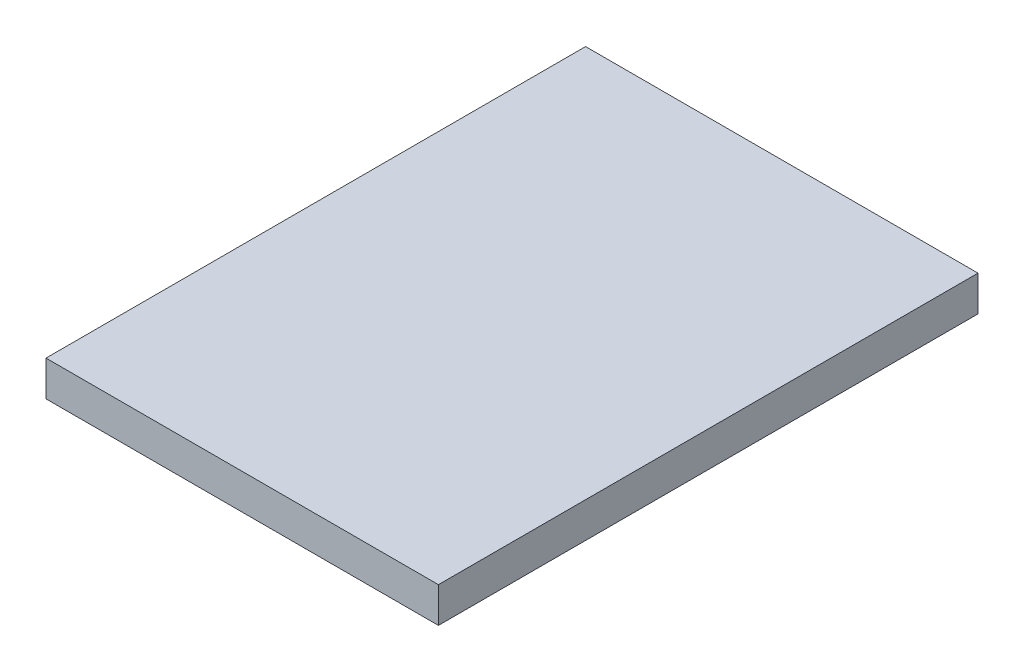
ISO-10303-21;
HEADER;
FILE_DESCRIPTION(('STEP AP214'),'2;1');
FILE_NAME('part.step','',(''),(''),'','','');
FILE_SCHEMA(('AUTOMOTIVE_DESIGN { 1 0 10303 214 1 1 1 1 }'));
ENDSEC;
DATA;
#1=APPLICATION_CONTEXT('core data for automotive mechanical design processes');
#2=APPLICATION_PROTOCOL_DEFINITION('international standard','automotive_design',2000,#1);
#3=PRODUCT_CONTEXT('',#1,'mechanical');
#4=PRODUCT('Part','Part','',(#3));
#5=PRODUCT_RELATED_PRODUCT_CATEGORY('part','',(#4));
#6=PRODUCT_DEFINITION_FORMATION('','',#4);
#7=PRODUCT_DEFINITION_CONTEXT('part definition',#1,'design');
#8=PRODUCT_DEFINITION('design','',#6,#7);
#9=PRODUCT_DEFINITION_SHAPE('','',#8);
#10=(LENGTH_UNIT() NAMED_UNIT(*) SI_UNIT(.MILLI.,.METRE.));
#11=(NAMED_UNIT(*) PLANE_ANGLE_UNIT() SI_UNIT($,.RADIAN.));
#12=(NAMED_UNIT(*) SI_UNIT($,.STERADIAN.) SOLID_ANGLE_UNIT());
#13=UNCERTAINTY_MEASURE_WITH_UNIT(LENGTH_MEASURE(1.E-05),#10,'distance_accuracy_value','');
#14=(GEOMETRIC_REPRESENTATION_CONTEXT(3) GLOBAL_UNCERTAINTY_ASSIGNED_CONTEXT((#13)) GLOBAL_UNIT_ASSIGNED_CONTEXT((#10,
#11,#12)) REPRESENTATION_CONTEXT('',''));
#15=CARTESIAN_POINT('',(0.,0.,0.));
#16=DIRECTION('',(0.,0.,1.));
#17=DIRECTION('',(1.,0.,0.));
#18=AXIS2_PLACEMENT_3D('',#15,#16,#17);
#19=CARTESIAN_POINT('',(-101.6,18.288,139.7));
#20=DIRECTION('',(1.,0.,0.));
#21=DIRECTION('',(0.,0.,-1.));
#22=AXIS2_PLACEMENT_3D('',#19,#20,#21);
#23=PLANE('',#22);
#24=DIRECTION('',(0.,0.,1.));
#25=VECTOR('',#24,1.);
#26=CARTESIAN_POINT('',(-101.6,0.,139.7));
#27=LINE('',#26,#25);
#28=CARTESIAN_POINT('',(-101.6,0.,-139.7));
#29=VERTEX_POINT('',#28);
#30=CARTESIAN_POINT('',(-101.6,0.,139.7));
#31=VERTEX_POINT('',#30);
#32=EDGE_CURVE('E97',#29,#31,#27,.T.);
#33=ORIENTED_EDGE('',*,*,#32,.T.);
#34=DIRECTION('',(0.,-1.,0.));
#35=VECTOR('',#34,1.);
#36=CARTESIAN_POINT('',(-101.6,18.288,139.7));
#37=LINE('',#36,#35);
#38=CARTESIAN_POINT('',(-101.6,18.288,139.7));
#39=VERTEX_POINT('',#38);
#40=EDGE_CURVE('E11',#39,#31,#37,.T.);
#41=ORIENTED_EDGE('',*,*,#40,.F.);
#42=DIRECTION('',(0.,0.,1.));
#43=VECTOR('',#42,1.);
#44=CARTESIAN_POINT('',(-101.6,18.288,139.7));
#45=LINE('',#44,#43);
#46=CARTESIAN_POINT('',(-101.6,18.288,-139.7));
#47=VERTEX_POINT('',#46);
#48=EDGE_CURVE('E85',#47,#39,#45,.T.);
#49=ORIENTED_EDGE('',*,*,#48,.F.);
#50=DIRECTION('',(0.,-1.,0.));
#51=VECTOR('',#50,1.);
#52=CARTESIAN_POINT('',(-101.6,18.288,-139.7));
#53=LINE('',#52,#51);
#54=EDGE_CURVE('E93',#47,#29,#53,.T.);
#55=ORIENTED_EDGE('',*,*,#54,.T.);
#56=EDGE_LOOP('',(#33,#41,#49,#55));
#57=FACE_BOUND('',#56,.T.);
#58=ADVANCED_FACE('F34',(#57),#23,.F.);
#59=CARTESIAN_POINT('',(101.6,18.288,139.7));
#60=DIRECTION('',(0.,0.,-1.));
#61=DIRECTION('',(-1.,0.,0.));
#62=AXIS2_PLACEMENT_3D('',#59,#60,#61);
#63=PLANE('',#62);
#64=DIRECTION('',(1.,0.,0.));
#65=VECTOR('',#64,1.);
#66=CARTESIAN_POINT('',(101.6,0.,139.7));
#67=LINE('',#66,#65);
#68=CARTESIAN_POINT('',(101.6,0.,139.7));
#69=VERTEX_POINT('',#68);
#70=EDGE_CURVE('E89',#31,#69,#67,.T.);
#71=ORIENTED_EDGE('',*,*,#70,.T.);
#72=DIRECTION('',(0.,-1.,0.));
#73=VECTOR('',#72,1.);
#74=CARTESIAN_POINT('',(101.6,18.288,139.7));
#75=LINE('',#74,#73);
#76=CARTESIAN_POINT('',(101.6,18.288,139.7));
#77=VERTEX_POINT('',#76);
#78=EDGE_CURVE('E42',#77,#69,#75,.T.);
#79=ORIENTED_EDGE('',*,*,#78,.F.);
#80=DIRECTION('',(1.,0.,0.));
#81=VECTOR('',#80,1.);
#82=CARTESIAN_POINT('',(101.6,18.288,139.7));
#83=LINE('',#82,#81);
#84=EDGE_CURVE('E80',#39,#77,#83,.T.);
#85=ORIENTED_EDGE('',*,*,#84,.F.);
#86=ORIENTED_EDGE('',*,*,#40,.T.);
#87=EDGE_LOOP('',(#71,#79,#85,#86));
#88=FACE_BOUND('',#87,.T.);
#89=ADVANCED_FACE('F88',(#88),#63,.F.);
#90=CARTESIAN_POINT('',(101.6,18.288,139.7));
#91=DIRECTION('',(-1.,0.,0.));
#92=DIRECTION('',(0.,0.,1.));
#93=AXIS2_PLACEMENT_3D('',#90,#91,#92);
#94=PLANE('',#93);
#95=DIRECTION('',(0.,0.,-1.));
#96=VECTOR('',#95,1.);
#97=CARTESIAN_POINT('',(101.6,0.,139.7));
#98=LINE('',#97,#96);
#99=CARTESIAN_POINT('',(101.6,0.,-139.7));
#100=VERTEX_POINT('',#99);
#101=EDGE_CURVE('E67',#69,#100,#98,.T.);
#102=ORIENTED_EDGE('',*,*,#101,.T.);
#103=DIRECTION('',(0.,-1.,0.));
#104=VECTOR('',#103,1.);
#105=CARTESIAN_POINT('',(101.6,18.288,-139.7));
#106=LINE('',#105,#104);
#107=CARTESIAN_POINT('',(101.6,18.288,-139.7));
#108=VERTEX_POINT('',#107);
#109=EDGE_CURVE('E90',#108,#100,#106,.T.);
#110=ORIENTED_EDGE('',*,*,#109,.F.);
#111=DIRECTION('',(0.,0.,-1.));
#112=VECTOR('',#111,1.);
#113=CARTESIAN_POINT('',(101.6,18.288,139.7));
#114=LINE('',#113,#112);
#115=EDGE_CURVE('E83',#77,#108,#114,.T.);
#116=ORIENTED_EDGE('',*,*,#115,.F.);
#117=ORIENTED_EDGE('',*,*,#78,.T.);
#118=EDGE_LOOP('',(#102,#110,#116,#117));
#119=FACE_BOUND('',#118,.T.);
#120=ADVANCED_FACE('F91',(#119),#94,.F.);
#121=CARTESIAN_POINT('',(101.6,18.288,-139.7));
#122=DIRECTION('',(0.,0.,1.));
#123=DIRECTION('',(1.,0.,0.));
#124=AXIS2_PLACEMENT_3D('',#121,#122,#123);
#125=PLANE('',#124);
#126=DIRECTION('',(-1.,0.,0.));
#127=VECTOR('',#126,1.);
#128=CARTESIAN_POINT('',(101.6,0.,-139.7));
#129=LINE('',#128,#127);
#130=EDGE_CURVE('E73',#100,#29,#129,.T.);
#131=ORIENTED_EDGE('',*,*,#130,.T.);
#132=ORIENTED_EDGE('',*,*,#54,.F.);
#133=DIRECTION('',(-1.,0.,0.));
#134=VECTOR('',#133,1.);
#135=CARTESIAN_POINT('',(101.6,18.288,-139.7));
#136=LINE('',#135,#134);
#137=EDGE_CURVE('E50',#108,#47,#136,.T.);
#138=ORIENTED_EDGE('',*,*,#137,.F.);
#139=ORIENTED_EDGE('',*,*,#109,.T.);
#140=EDGE_LOOP('',(#131,#132,#138,#139));
#141=FACE_BOUND('',#140,.T.);
#142=ADVANCED_FACE('F104',(#141),#125,.F.);
#143=CARTESIAN_POINT('',(0.,18.288,0.));
#144=DIRECTION('',(0.,1.,0.));
#145=DIRECTION('',(0.,0.,1.));
#146=AXIS2_PLACEMENT_3D('',#143,#144,#145);
#147=PLANE('',#146);
#148=ORIENTED_EDGE('',*,*,#48,.T.);
#149=ORIENTED_EDGE('',*,*,#84,.T.);
#150=ORIENTED_EDGE('',*,*,#115,.T.);
#151=ORIENTED_EDGE('',*,*,#137,.T.);
#152=EDGE_LOOP('',(#148,#149,#150,#151));
#153=FACE_BOUND('',#152,.T.);
#154=ADVANCED_FACE('F81',(#153),#147,.T.);
#155=CARTESIAN_POINT('',(0.,0.,0.));
#156=DIRECTION('',(0.,1.,0.));
#157=DIRECTION('',(0.,0.,1.));
#158=AXIS2_PLACEMENT_3D('',#155,#156,#157);
#159=PLANE('',#158);
#160=ORIENTED_EDGE('',*,*,#32,.F.);
#161=ORIENTED_EDGE('',*,*,#130,.F.);
#162=ORIENTED_EDGE('',*,*,#101,.F.);
#163=ORIENTED_EDGE('',*,*,#70,.F.);
#164=EDGE_LOOP('',(#160,#161,#162,#163));
#165=FACE_BOUND('',#164,.T.);
#166=ADVANCED_FACE('F107',(#165),#159,.F.);
#167=CLOSED_SHELL('',(#58,#89,#120,#142,#154,#166));
#168=MANIFOLD_SOLID_BREP('B2',#167);
#169=ADVANCED_BREP_SHAPE_REPRESENTATION('',(#18,#168),#14);
#170=SHAPE_DEFINITION_REPRESENTATION(#9,#169);
ENDSEC;
END-ISO-10303-21;
